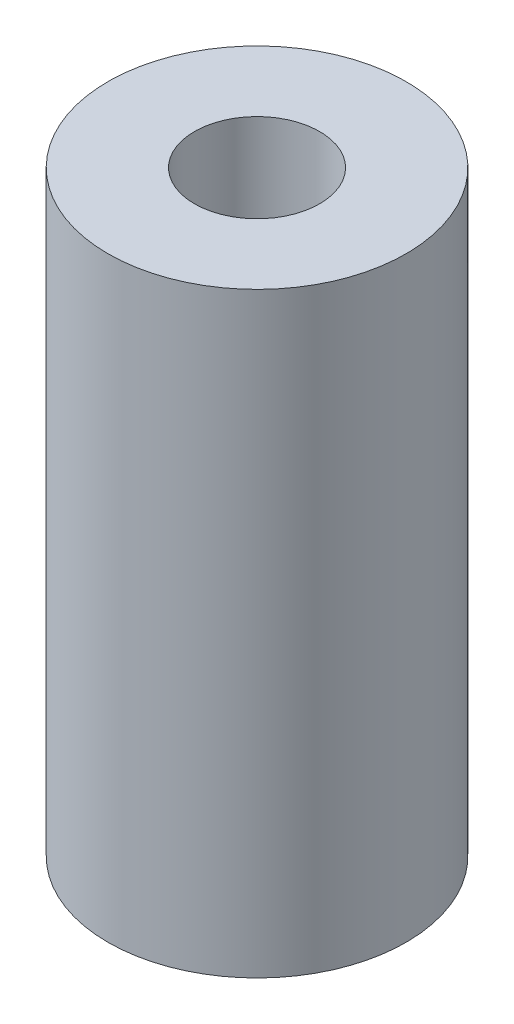
ISO-10303-21;
HEADER;
FILE_DESCRIPTION(('STEP AP214'),'2;1');
FILE_NAME('part.step','',(''),(''),'','','');
FILE_SCHEMA(('AUTOMOTIVE_DESIGN { 1 0 10303 214 1 1 1 1 }'));
ENDSEC;
DATA;
#1=APPLICATION_CONTEXT('core data for automotive mechanical design processes');
#2=APPLICATION_PROTOCOL_DEFINITION('international standard','automotive_design',2000,#1);
#3=PRODUCT_CONTEXT('',#1,'mechanical');
#4=PRODUCT('Part','Part','',(#3));
#5=PRODUCT_RELATED_PRODUCT_CATEGORY('part','',(#4));
#6=PRODUCT_DEFINITION_FORMATION('','',#4);
#7=PRODUCT_DEFINITION_CONTEXT('part definition',#1,'design');
#8=PRODUCT_DEFINITION('design','',#6,#7);
#9=PRODUCT_DEFINITION_SHAPE('','',#8);
#10=(LENGTH_UNIT() NAMED_UNIT(*) SI_UNIT(.MILLI.,.METRE.));
#11=(NAMED_UNIT(*) PLANE_ANGLE_UNIT() SI_UNIT($,.RADIAN.));
#12=(NAMED_UNIT(*) SI_UNIT($,.STERADIAN.) SOLID_ANGLE_UNIT());
#13=UNCERTAINTY_MEASURE_WITH_UNIT(LENGTH_MEASURE(1.E-05),#10,'distance_accuracy_value','');
#14=(GEOMETRIC_REPRESENTATION_CONTEXT(3) GLOBAL_UNCERTAINTY_ASSIGNED_CONTEXT((#13)) GLOBAL_UNIT_ASSIGNED_CONTEXT((#10,
#11,#12)) REPRESENTATION_CONTEXT('',''));
#15=CARTESIAN_POINT('',(0.,0.,0.));
#16=DIRECTION('',(0.,0.,1.));
#17=DIRECTION('',(1.,0.,0.));
#18=AXIS2_PLACEMENT_3D('',#15,#16,#17);
#19=CARTESIAN_POINT('',(0.,25.4,0.));
#20=DIRECTION('',(0.,1.,0.));
#21=DIRECTION('',(0.,0.,1.));
#22=AXIS2_PLACEMENT_3D('',#19,#20,#21);
#23=PLANE('',#22);
#24=CARTESIAN_POINT('',(0.,25.4,0.));
#25=DIRECTION('',(0.,1.,0.));
#26=DIRECTION('',(0.,0.,1.));
#27=AXIS2_PLACEMENT_3D('',#24,#25,#26);
#28=CIRCLE('',#27,6.35);
#29=CARTESIAN_POINT('',(0.,25.4,6.35));
#30=VERTEX_POINT('',#29);
#31=EDGE_CURVE('E10',#30,#30,#28,.T.);
#32=ORIENTED_EDGE('',*,*,#31,.T.);
#33=EDGE_LOOP('',(#32));
#34=FACE_BOUND('',#33,.T.);
#35=CARTESIAN_POINT('',(0.,25.4,0.));
#36=DIRECTION('',(0.,1.,0.));
#37=DIRECTION('',(0.,0.,1.));
#38=AXIS2_PLACEMENT_3D('',#35,#36,#37);
#39=CIRCLE('',#38,2.667);
#40=CARTESIAN_POINT('',(0.,25.4,2.667));
#41=VERTEX_POINT('',#40);
#42=EDGE_CURVE('E46',#41,#41,#39,.T.);
#43=ORIENTED_EDGE('',*,*,#42,.F.);
#44=EDGE_LOOP('',(#43));
#45=FACE_BOUND('',#44,.T.);
#46=ADVANCED_FACE('F35',(#34,#45),#23,.T.);
#47=CARTESIAN_POINT('',(0.,0.,0.));
#48=DIRECTION('',(0.,1.,0.));
#49=DIRECTION('',(0.,0.,1.));
#50=AXIS2_PLACEMENT_3D('',#47,#48,#49);
#51=PLANE('',#50);
#52=CARTESIAN_POINT('',(0.,0.,0.));
#53=DIRECTION('',(0.,1.,0.));
#54=DIRECTION('',(0.,0.,1.));
#55=AXIS2_PLACEMENT_3D('',#52,#53,#54);
#56=CIRCLE('',#55,6.35);
#57=CARTESIAN_POINT('',(0.,0.,6.35));
#58=VERTEX_POINT('',#57);
#59=EDGE_CURVE('E39',#58,#58,#56,.T.);
#60=ORIENTED_EDGE('',*,*,#59,.F.);
#61=EDGE_LOOP('',(#60));
#62=FACE_BOUND('',#61,.T.);
#63=CARTESIAN_POINT('',(0.,0.,0.));
#64=DIRECTION('',(0.,1.,0.));
#65=DIRECTION('',(0.,0.,1.));
#66=AXIS2_PLACEMENT_3D('',#63,#64,#65);
#67=CIRCLE('',#66,2.667);
#68=CARTESIAN_POINT('',(0.,0.,2.667));
#69=VERTEX_POINT('',#68);
#70=EDGE_CURVE('E48',#69,#69,#67,.T.);
#71=ORIENTED_EDGE('',*,*,#70,.T.);
#72=EDGE_LOOP('',(#71));
#73=FACE_BOUND('',#72,.T.);
#74=ADVANCED_FACE('F58',(#62,#73),#51,.F.);
#75=CARTESIAN_POINT('',(0.,25.4,0.));
#76=DIRECTION('',(0.,-1.,0.));
#77=DIRECTION('',(0.,0.,-1.));
#78=AXIS2_PLACEMENT_3D('',#75,#76,#77);
#79=CYLINDRICAL_SURFACE('',#78,6.35);
#80=ORIENTED_EDGE('',*,*,#31,.F.);
#81=EDGE_LOOP('',(#80));
#82=FACE_BOUND('',#81,.T.);
#83=ORIENTED_EDGE('',*,*,#59,.T.);
#84=EDGE_LOOP('',(#83));
#85=FACE_BOUND('',#84,.T.);
#86=ADVANCED_FACE('F37',(#82,#85),#79,.T.);
#87=CARTESIAN_POINT('',(0.,25.4,0.));
#88=DIRECTION('',(0.,-1.,0.));
#89=DIRECTION('',(0.,0.,-1.));
#90=AXIS2_PLACEMENT_3D('',#87,#88,#89);
#91=CYLINDRICAL_SURFACE('',#90,2.667);
#92=ORIENTED_EDGE('',*,*,#42,.T.);
#93=EDGE_LOOP('',(#92));
#94=FACE_BOUND('',#93,.T.);
#95=ORIENTED_EDGE('',*,*,#70,.F.);
#96=EDGE_LOOP('',(#95));
#97=FACE_BOUND('',#96,.T.);
#98=ADVANCED_FACE('F54',(#94,#97),#91,.F.);
#99=CLOSED_SHELL('',(#46,#74,#86,#98));
#100=MANIFOLD_SOLID_BREP('B2',#99);
#101=ADVANCED_BREP_SHAPE_REPRESENTATION('',(#18,#100),#14);
#102=SHAPE_DEFINITION_REPRESENTATION(#9,#101);
ENDSEC;
END-ISO-10303-21;
